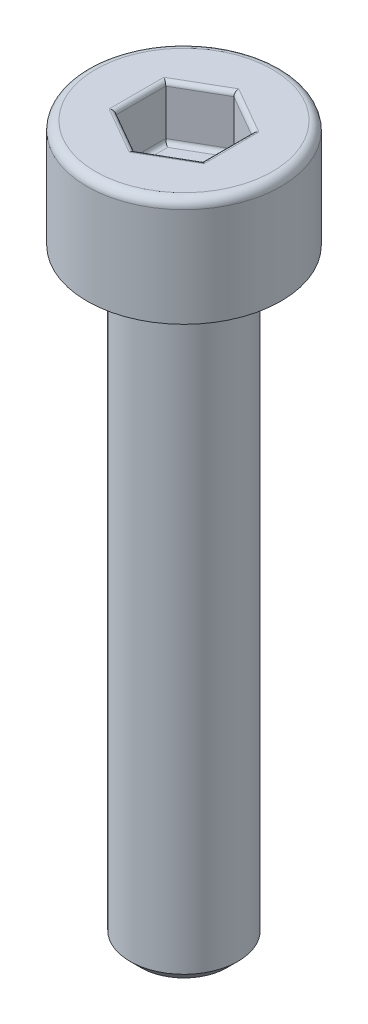
ISO-10303-21;
HEADER;
FILE_DESCRIPTION(('STEP AP214'),'2;1');
FILE_NAME('part.step','',(''),(''),'','','');
FILE_SCHEMA(('AUTOMOTIVE_DESIGN { 1 0 10303 214 1 1 1 1 }'));
ENDSEC;
DATA;
#1=APPLICATION_CONTEXT('core data for automotive mechanical design processes');
#2=APPLICATION_PROTOCOL_DEFINITION('international standard','automotive_design',2000,#1);
#3=PRODUCT_CONTEXT('',#1,'mechanical');
#4=PRODUCT('Part','Part','',(#3));
#5=PRODUCT_RELATED_PRODUCT_CATEGORY('part','',(#4));
#6=PRODUCT_DEFINITION_FORMATION('','',#4);
#7=PRODUCT_DEFINITION_CONTEXT('part definition',#1,'design');
#8=PRODUCT_DEFINITION('design','',#6,#7);
#9=PRODUCT_DEFINITION_SHAPE('','',#8);
#10=(LENGTH_UNIT() NAMED_UNIT(*) SI_UNIT(.MILLI.,.METRE.));
#11=(NAMED_UNIT(*) PLANE_ANGLE_UNIT() SI_UNIT($,.RADIAN.));
#12=(NAMED_UNIT(*) SI_UNIT($,.STERADIAN.) SOLID_ANGLE_UNIT());
#13=UNCERTAINTY_MEASURE_WITH_UNIT(LENGTH_MEASURE(1.E-05),#10,'distance_accuracy_value','');
#14=(GEOMETRIC_REPRESENTATION_CONTEXT(3) GLOBAL_UNCERTAINTY_ASSIGNED_CONTEXT((#13)) GLOBAL_UNIT_ASSIGNED_CONTEXT((#10,
#11,#12)) REPRESENTATION_CONTEXT('',''));
#15=CARTESIAN_POINT('',(0.,0.,0.));
#16=DIRECTION('',(0.,0.,1.));
#17=DIRECTION('',(1.,0.,0.));
#18=AXIS2_PLACEMENT_3D('',#15,#16,#17);
#19=CARTESIAN_POINT('',(0.,-16.5,0.));
#20=DIRECTION('',(0.,-1.,0.));
#21=DIRECTION('',(0.,0.,-1.));
#22=AXIS2_PLACEMENT_3D('',#19,#20,#21);
#23=PLANE('',#22);
#24=CARTESIAN_POINT('',(0.,-16.5,0.));
#25=DIRECTION('',(0.,-1.,0.));
#26=DIRECTION('',(0.,0.,-1.));
#27=AXIS2_PLACEMENT_3D('',#24,#25,#26);
#28=CIRCLE('',#27,0.999999999999997);
#29=CARTESIAN_POINT('',(0.,-16.5,-0.999999999999997));
#30=VERTEX_POINT('',#29);
#31=EDGE_CURVE('E261',#30,#30,#28,.T.);
#32=ORIENTED_EDGE('',*,*,#31,.T.);
#33=EDGE_LOOP('',(#32));
#34=FACE_BOUND('',#33,.T.);
#35=ADVANCED_FACE('F33',(#34),#23,.T.);
#36=CARTESIAN_POINT('',(0.,0.,0.));
#37=DIRECTION('',(0.,1.,0.));
#38=DIRECTION('',(0.,0.,1.));
#39=AXIS2_PLACEMENT_3D('',#36,#37,#38);
#40=CYLINDRICAL_SURFACE('',#39,1.25);
#41=CARTESIAN_POINT('',(0.,-2.75,0.));
#42=DIRECTION('',(0.,-1.,0.));
#43=DIRECTION('',(0.,0.,-1.));
#44=AXIS2_PLACEMENT_3D('',#41,#42,#43);
#45=CIRCLE('',#44,1.25);
#46=CARTESIAN_POINT('',(0.,-2.75,-1.25));
#47=VERTEX_POINT('',#46);
#48=EDGE_CURVE('E258',#47,#47,#45,.T.);
#49=ORIENTED_EDGE('',*,*,#48,.T.);
#50=EDGE_LOOP('',(#49));
#51=FACE_BOUND('',#50,.T.);
#52=CARTESIAN_POINT('',(0.,-16.25,0.));
#53=DIRECTION('',(0.,-1.,0.));
#54=DIRECTION('',(0.,0.,-1.));
#55=AXIS2_PLACEMENT_3D('',#52,#53,#54);
#56=CIRCLE('',#55,1.25);
#57=CARTESIAN_POINT('',(0.,-16.25,-1.25));
#58=VERTEX_POINT('',#57);
#59=EDGE_CURVE('E255',#58,#58,#56,.F.);
#60=ORIENTED_EDGE('',*,*,#59,.T.);
#61=EDGE_LOOP('',(#60));
#62=FACE_BOUND('',#61,.T.);
#63=ADVANCED_FACE('F287',(#51,#62),#40,.T.);
#64=CARTESIAN_POINT('',(-1.25,-2.5,0.));
#65=DIRECTION('',(0.,-1.,0.));
#66=DIRECTION('',(0.,0.,-1.));
#67=AXIS2_PLACEMENT_3D('',#64,#65,#66);
#68=PLANE('',#67);
#69=CARTESIAN_POINT('',(0.,-2.5,0.));
#70=DIRECTION('',(0.,-1.,0.));
#71=DIRECTION('',(0.,0.,-1.));
#72=AXIS2_PLACEMENT_3D('',#69,#70,#71);
#73=CIRCLE('',#72,1.49999999999999);
#74=CARTESIAN_POINT('',(0.,-2.5,-1.49999999999999));
#75=VERTEX_POINT('',#74);
#76=EDGE_CURVE('E252',#75,#75,#73,.F.);
#77=ORIENTED_EDGE('',*,*,#76,.T.);
#78=EDGE_LOOP('',(#77));
#79=FACE_BOUND('',#78,.T.);
#80=CARTESIAN_POINT('',(0.,-2.5,0.));
#81=DIRECTION('',(0.,1.,0.));
#82=DIRECTION('',(0.,0.,1.));
#83=AXIS2_PLACEMENT_3D('',#80,#81,#82);
#84=CIRCLE('',#83,2.25);
#85=CARTESIAN_POINT('',(0.,-2.5,2.25));
#86=VERTEX_POINT('',#85);
#87=EDGE_CURVE('E249',#86,#86,#84,.T.);
#88=ORIENTED_EDGE('',*,*,#87,.F.);
#89=EDGE_LOOP('',(#88));
#90=FACE_BOUND('',#89,.T.);
#91=ADVANCED_FACE('F293',(#79,#90),#68,.T.);
#92=CARTESIAN_POINT('',(0.,0.,0.));
#93=DIRECTION('',(0.,1.,0.));
#94=DIRECTION('',(0.,0.,1.));
#95=AXIS2_PLACEMENT_3D('',#92,#93,#94);
#96=CYLINDRICAL_SURFACE('',#95,2.25);
#97=CARTESIAN_POINT('',(0.,-0.2,0.));
#98=DIRECTION('',(0.,1.,0.));
#99=DIRECTION('',(0.,0.,1.));
#100=AXIS2_PLACEMENT_3D('',#97,#98,#99);
#101=CIRCLE('',#100,2.25);
#102=CARTESIAN_POINT('',(0.,-0.2,2.25));
#103=VERTEX_POINT('',#102);
#104=EDGE_CURVE('E159',#103,#103,#101,.F.);
#105=ORIENTED_EDGE('',*,*,#104,.T.);
#106=EDGE_LOOP('',(#105));
#107=FACE_BOUND('',#106,.T.);
#108=ORIENTED_EDGE('',*,*,#87,.T.);
#109=EDGE_LOOP('',(#108));
#110=FACE_BOUND('',#109,.T.);
#111=ADVANCED_FACE('F303',(#107,#110),#96,.T.);
#112=CARTESIAN_POINT('',(-2.25,0.,0.));
#113=DIRECTION('',(0.,1.,0.));
#114=DIRECTION('',(0.,0.,1.));
#115=AXIS2_PLACEMENT_3D('',#112,#113,#114);
#116=PLANE('',#115);
#117=DIRECTION('',(0.,0.,1.));
#118=VECTOR('',#117,1.);
#119=CARTESIAN_POINT('',(-1.1,0.,-0.577350269189627));
#120=LINE('',#119,#118);
#121=CARTESIAN_POINT('',(-1.1,0.,0.635085296108588));
#122=VERTEX_POINT('',#121);
#123=CARTESIAN_POINT('',(-1.1,0.,-0.635085296108589));
#124=VERTEX_POINT('',#123);
#125=EDGE_CURVE('E175',#122,#124,#120,.F.);
#126=ORIENTED_EDGE('',*,*,#125,.T.);
#127=DIRECTION('',(-0.866025403784439,0.,0.5));
#128=VECTOR('',#127,1.);
#129=CARTESIAN_POINT('',(-0.0500000000000009,0.,-1.2413030787577));
#130=LINE('',#129,#128);
#131=CARTESIAN_POINT('',(0.,0.,-1.27017059221718));
#132=VERTEX_POINT('',#131);
#133=EDGE_CURVE('E134',#124,#132,#130,.F.);
#134=ORIENTED_EDGE('',*,*,#133,.T.);
#135=DIRECTION('',(-0.866025403784439,0.,-0.5));
#136=VECTOR('',#135,1.);
#137=CARTESIAN_POINT('',(1.05,0.,-0.663952809568071));
#138=LINE('',#137,#136);
#139=CARTESIAN_POINT('',(1.1,0.,-0.63508529610859));
#140=VERTEX_POINT('',#139);
#141=EDGE_CURVE('E161',#132,#140,#138,.F.);
#142=ORIENTED_EDGE('',*,*,#141,.T.);
#143=DIRECTION('',(0.,0.,-1.));
#144=VECTOR('',#143,1.);
#145=CARTESIAN_POINT('',(1.1,0.,0.577350269189625));
#146=LINE('',#145,#144);
#147=CARTESIAN_POINT('',(1.1,0.,0.635085296108588));
#148=VERTEX_POINT('',#147);
#149=EDGE_CURVE('E169',#140,#148,#146,.F.);
#150=ORIENTED_EDGE('',*,*,#149,.T.);
#151=DIRECTION('',(0.866025403784439,0.,-0.5));
#152=VECTOR('',#151,1.);
#153=CARTESIAN_POINT('',(0.0499999999999991,0.,1.24130307875769));
#154=LINE('',#153,#152);
#155=CARTESIAN_POINT('',(0.,0.,1.27017059221718));
#156=VERTEX_POINT('',#155);
#157=EDGE_CURVE('E171',#148,#156,#154,.F.);
#158=ORIENTED_EDGE('',*,*,#157,.T.);
#159=DIRECTION('',(0.866025403784439,0.,0.5));
#160=VECTOR('',#159,1.);
#161=CARTESIAN_POINT('',(-1.05,0.,0.663952809568069));
#162=LINE('',#161,#160);
#163=EDGE_CURVE('E173',#156,#122,#162,.F.);
#164=ORIENTED_EDGE('',*,*,#163,.T.);
#165=EDGE_LOOP('',(#126,#134,#142,#150,#158,#164));
#166=FACE_BOUND('',#165,.T.);
#167=CARTESIAN_POINT('',(0.,0.,0.));
#168=DIRECTION('',(0.,1.,0.));
#169=DIRECTION('',(0.,0.,1.));
#170=AXIS2_PLACEMENT_3D('',#167,#168,#169);
#171=CIRCLE('',#170,2.05);
#172=CARTESIAN_POINT('',(0.,0.,2.05));
#173=VERTEX_POINT('',#172);
#174=EDGE_CURVE('E164',#173,#173,#171,.T.);
#175=ORIENTED_EDGE('',*,*,#174,.T.);
#176=EDGE_LOOP('',(#175));
#177=FACE_BOUND('',#176,.T.);
#178=ADVANCED_FACE('F266',(#166,#177),#116,.T.);
#179=CARTESIAN_POINT('',(0.,-2.5,0.));
#180=DIRECTION('',(0.,1.,0.));
#181=DIRECTION('',(0.,0.,1.));
#182=AXIS2_PLACEMENT_3D('',#179,#180,#181);
#183=CONICAL_SURFACE('',#182,1.49999999999999,0.78539816339745);
#184=ORIENTED_EDGE('',*,*,#48,.F.);
#185=EDGE_LOOP('',(#184));
#186=FACE_BOUND('',#185,.T.);
#187=ORIENTED_EDGE('',*,*,#76,.F.);
#188=EDGE_LOOP('',(#187));
#189=FACE_BOUND('',#188,.T.);
#190=ADVANCED_FACE('F281',(#186,#189),#183,.T.);
#191=CARTESIAN_POINT('',(0.,-16.25,0.));
#192=DIRECTION('',(0.,1.,0.));
#193=DIRECTION('',(0.,0.,1.));
#194=AXIS2_PLACEMENT_3D('',#191,#192,#193);
#195=CONICAL_SURFACE('',#194,1.25,0.785398163397447);
#196=ORIENTED_EDGE('',*,*,#31,.F.);
#197=EDGE_LOOP('',(#196));
#198=FACE_BOUND('',#197,.T.);
#199=ORIENTED_EDGE('',*,*,#59,.F.);
#200=EDGE_LOOP('',(#199));
#201=FACE_BOUND('',#200,.T.);
#202=ADVANCED_FACE('F271',(#198,#201),#195,.T.);
#203=CARTESIAN_POINT('',(0.,-0.2,0.));
#204=DIRECTION('',(0.,1.,0.));
#205=DIRECTION('',(0.,0.,1.));
#206=AXIS2_PLACEMENT_3D('',#203,#204,#205);
#207=TOROIDAL_SURFACE('',#206,2.05,0.2);
#208=ORIENTED_EDGE('',*,*,#104,.F.);
#209=EDGE_LOOP('',(#208));
#210=FACE_BOUND('',#209,.T.);
#211=ORIENTED_EDGE('',*,*,#174,.F.);
#212=EDGE_LOOP('',(#211));
#213=FACE_BOUND('',#212,.T.);
#214=ADVANCED_FACE('F268',(#210,#213),#207,.T.);
#215=CARTESIAN_POINT('',(0.999999999999998,-1.25,-0.577350269189627));
#216=DIRECTION('',(0.5,0.,-0.866025403784439));
#217=DIRECTION('',(-0.866025403784439,0.,-0.5));
#218=AXIS2_PLACEMENT_3D('',#215,#216,#217);
#219=PLANE('',#218);
#220=DIRECTION('',(0.,1.,0.));
#221=VECTOR('',#220,1.);
#222=CARTESIAN_POINT('',(0.999999999999998,-1.25,-0.577350269189627));
#223=LINE('',#222,#221);
#224=CARTESIAN_POINT('',(0.999999999999998,-1.15,-0.577350269189627));
#225=VERTEX_POINT('',#224);
#226=CARTESIAN_POINT('',(0.999999999999998,-0.1,-0.577350269189627));
#227=VERTEX_POINT('',#226);
#228=EDGE_CURVE('E243',#225,#227,#223,.T.);
#229=ORIENTED_EDGE('',*,*,#228,.T.);
#230=DIRECTION('',(-0.866025403784439,0.,-0.5));
#231=VECTOR('',#230,1.);
#232=CARTESIAN_POINT('',(0.,-0.1,-1.15470053837925));
#233=LINE('',#232,#231);
#234=CARTESIAN_POINT('',(0.,-0.1,-1.15470053837925));
#235=VERTEX_POINT('',#234);
#236=EDGE_CURVE('E195',#227,#235,#233,.T.);
#237=ORIENTED_EDGE('',*,*,#236,.T.);
#238=DIRECTION('',(0.,1.,0.));
#239=VECTOR('',#238,1.);
#240=CARTESIAN_POINT('',(0.,-1.25,-1.15470053837925));
#241=LINE('',#240,#239);
#242=CARTESIAN_POINT('',(0.,-1.15,-1.15470053837925));
#243=VERTEX_POINT('',#242);
#244=EDGE_CURVE('E145',#243,#235,#241,.T.);
#245=ORIENTED_EDGE('',*,*,#244,.F.);
#246=DIRECTION('',(-0.866025403784439,0.,-0.5));
#247=VECTOR('',#246,1.);
#248=CARTESIAN_POINT('',(0.999999999999998,-1.15,-0.577350269189627));
#249=LINE('',#248,#247);
#250=EDGE_CURVE('E193',#243,#225,#249,.F.);
#251=ORIENTED_EDGE('',*,*,#250,.T.);
#252=EDGE_LOOP('',(#229,#237,#245,#251));
#253=FACE_BOUND('',#252,.T.);
#254=ADVANCED_FACE('F270',(#253),#219,.F.);
#255=CARTESIAN_POINT('',(0.999999999999999,-1.25,0.577350269189625));
#256=DIRECTION('',(1.,0.,0.));
#257=DIRECTION('',(0.,0.,-1.));
#258=AXIS2_PLACEMENT_3D('',#255,#256,#257);
#259=PLANE('',#258);
#260=DIRECTION('',(0.,1.,0.));
#261=VECTOR('',#260,1.);
#262=CARTESIAN_POINT('',(0.999999999999999,-1.25,0.577350269189625));
#263=LINE('',#262,#261);
#264=CARTESIAN_POINT('',(0.999999999999999,-1.15,0.577350269189625));
#265=VERTEX_POINT('',#264);
#266=CARTESIAN_POINT('',(0.999999999999999,-0.1,0.577350269189625));
#267=VERTEX_POINT('',#266);
#268=EDGE_CURVE('E240',#265,#267,#263,.T.);
#269=ORIENTED_EDGE('',*,*,#268,.T.);
#270=DIRECTION('',(0.,0.,-1.));
#271=VECTOR('',#270,1.);
#272=CARTESIAN_POINT('',(0.999999999999998,-0.1,-0.577350269189627));
#273=LINE('',#272,#271);
#274=EDGE_CURVE('E191',#267,#227,#273,.T.);
#275=ORIENTED_EDGE('',*,*,#274,.T.);
#276=ORIENTED_EDGE('',*,*,#228,.F.);
#277=DIRECTION('',(0.,0.,-1.));
#278=VECTOR('',#277,1.);
#279=CARTESIAN_POINT('',(0.999999999999999,-1.15,0.577350269189625));
#280=LINE('',#279,#278);
#281=EDGE_CURVE('E188',#225,#265,#280,.F.);
#282=ORIENTED_EDGE('',*,*,#281,.T.);
#283=EDGE_LOOP('',(#269,#275,#276,#282));
#284=FACE_BOUND('',#283,.T.);
#285=ADVANCED_FACE('F278',(#284),#259,.F.);
#286=CARTESIAN_POINT('',(0.,-1.25,1.15470053837925));
#287=DIRECTION('',(0.5,0.,0.866025403784439));
#288=DIRECTION('',(0.866025403784439,0.,-0.5));
#289=AXIS2_PLACEMENT_3D('',#286,#287,#288);
#290=PLANE('',#289);
#291=DIRECTION('',(0.,1.,0.));
#292=VECTOR('',#291,1.);
#293=CARTESIAN_POINT('',(0.,-1.25,1.15470053837925));
#294=LINE('',#293,#292);
#295=CARTESIAN_POINT('',(0.,-1.15,1.15470053837925));
#296=VERTEX_POINT('',#295);
#297=CARTESIAN_POINT('',(0.,-0.1,1.15470053837925));
#298=VERTEX_POINT('',#297);
#299=EDGE_CURVE('E237',#296,#298,#294,.T.);
#300=ORIENTED_EDGE('',*,*,#299,.T.);
#301=DIRECTION('',(0.866025403784439,0.,-0.5));
#302=VECTOR('',#301,1.);
#303=CARTESIAN_POINT('',(0.999999999999999,-0.1,0.577350269189625));
#304=LINE('',#303,#302);
#305=EDGE_CURVE('E186',#298,#267,#304,.T.);
#306=ORIENTED_EDGE('',*,*,#305,.T.);
#307=ORIENTED_EDGE('',*,*,#268,.F.);
#308=DIRECTION('',(0.866025403784439,0.,-0.5));
#309=VECTOR('',#308,1.);
#310=CARTESIAN_POINT('',(0.,-1.15,1.15470053837925));
#311=LINE('',#310,#309);
#312=EDGE_CURVE('E184',#265,#296,#311,.F.);
#313=ORIENTED_EDGE('',*,*,#312,.T.);
#314=EDGE_LOOP('',(#300,#306,#307,#313));
#315=FACE_BOUND('',#314,.T.);
#316=ADVANCED_FACE('F327',(#315),#290,.F.);
#317=CARTESIAN_POINT('',(-1.,-1.25,0.577350269189625));
#318=DIRECTION('',(-0.5,0.,0.866025403784438));
#319=DIRECTION('',(0.866025403784439,0.,0.5));
#320=AXIS2_PLACEMENT_3D('',#317,#318,#319);
#321=PLANE('',#320);
#322=DIRECTION('',(0.,1.,0.));
#323=VECTOR('',#322,1.);
#324=CARTESIAN_POINT('',(-1.,-1.25,0.577350269189625));
#325=LINE('',#324,#323);
#326=CARTESIAN_POINT('',(-1.,-1.15,0.577350269189625));
#327=VERTEX_POINT('',#326);
#328=CARTESIAN_POINT('',(-1.,-0.1,0.577350269189625));
#329=VERTEX_POINT('',#328);
#330=EDGE_CURVE('E128',#327,#329,#325,.T.);
#331=ORIENTED_EDGE('',*,*,#330,.T.);
#332=DIRECTION('',(0.866025403784439,0.,0.5));
#333=VECTOR('',#332,1.);
#334=CARTESIAN_POINT('',(0.,-0.1,1.15470053837925));
#335=LINE('',#334,#333);
#336=EDGE_CURVE('E182',#329,#298,#335,.T.);
#337=ORIENTED_EDGE('',*,*,#336,.T.);
#338=ORIENTED_EDGE('',*,*,#299,.F.);
#339=DIRECTION('',(0.866025403784439,0.,0.5));
#340=VECTOR('',#339,1.);
#341=CARTESIAN_POINT('',(-1.,-1.15,0.577350269189625));
#342=LINE('',#341,#340);
#343=EDGE_CURVE('E180',#296,#327,#342,.F.);
#344=ORIENTED_EDGE('',*,*,#343,.T.);
#345=EDGE_LOOP('',(#331,#337,#338,#344));
#346=FACE_BOUND('',#345,.T.);
#347=ADVANCED_FACE('F234',(#346),#321,.F.);
#348=CARTESIAN_POINT('',(-1.,-1.25,-0.577350269189627));
#349=DIRECTION('',(-1.,0.,0.));
#350=DIRECTION('',(0.,0.,1.));
#351=AXIS2_PLACEMENT_3D('',#348,#349,#350);
#352=PLANE('',#351);
#353=DIRECTION('',(0.,1.,0.));
#354=VECTOR('',#353,1.);
#355=CARTESIAN_POINT('',(-1.,-1.25,-0.577350269189627));
#356=LINE('',#355,#354);
#357=CARTESIAN_POINT('',(-1.,-1.15,-0.577350269189627));
#358=VERTEX_POINT('',#357);
#359=CARTESIAN_POINT('',(-1.,-0.1,-0.577350269189627));
#360=VERTEX_POINT('',#359);
#361=EDGE_CURVE('E126',#358,#360,#356,.T.);
#362=ORIENTED_EDGE('',*,*,#361,.T.);
#363=DIRECTION('',(0.,0.,1.));
#364=VECTOR('',#363,1.);
#365=CARTESIAN_POINT('',(-1.,-0.1,0.577350269189625));
#366=LINE('',#365,#364);
#367=EDGE_CURVE('E133',#360,#329,#366,.T.);
#368=ORIENTED_EDGE('',*,*,#367,.T.);
#369=ORIENTED_EDGE('',*,*,#330,.F.);
#370=DIRECTION('',(0.,0.,1.));
#371=VECTOR('',#370,1.);
#372=CARTESIAN_POINT('',(-1.,-1.15,-0.577350269189627));
#373=LINE('',#372,#371);
#374=EDGE_CURVE('E123',#327,#358,#373,.F.);
#375=ORIENTED_EDGE('',*,*,#374,.T.);
#376=EDGE_LOOP('',(#362,#368,#369,#375));
#377=FACE_BOUND('',#376,.T.);
#378=ADVANCED_FACE('F125',(#377),#352,.F.);
#379=CARTESIAN_POINT('',(0.,-1.25,-1.15470053837925));
#380=DIRECTION('',(-0.5,0.,-0.866025403784438));
#381=DIRECTION('',(-0.866025403784439,0.,0.5));
#382=AXIS2_PLACEMENT_3D('',#379,#380,#381);
#383=PLANE('',#382);
#384=ORIENTED_EDGE('',*,*,#244,.T.);
#385=DIRECTION('',(-0.866025403784439,0.,0.5));
#386=VECTOR('',#385,1.);
#387=CARTESIAN_POINT('',(-1.,-0.1,-0.577350269189626));
#388=LINE('',#387,#386);
#389=EDGE_CURVE('E144',#235,#360,#388,.T.);
#390=ORIENTED_EDGE('',*,*,#389,.T.);
#391=ORIENTED_EDGE('',*,*,#361,.F.);
#392=DIRECTION('',(-0.866025403784439,0.,0.5));
#393=VECTOR('',#392,1.);
#394=CARTESIAN_POINT('',(0.,-1.15,-1.15470053837925));
#395=LINE('',#394,#393);
#396=EDGE_CURVE('E141',#358,#243,#395,.F.);
#397=ORIENTED_EDGE('',*,*,#396,.T.);
#398=EDGE_LOOP('',(#384,#390,#391,#397));
#399=FACE_BOUND('',#398,.T.);
#400=ADVANCED_FACE('F139',(#399),#383,.F.);
#401=CARTESIAN_POINT('',(0.,-1.25,-1.15470053837925));
#402=DIRECTION('',(0.,1.,0.));
#403=DIRECTION('',(0.,0.,1.));
#404=AXIS2_PLACEMENT_3D('',#401,#402,#403);
#405=PLANE('',#404);
#406=DIRECTION('',(0.866025403784439,0.,-0.5));
#407=VECTOR('',#406,1.);
#408=CARTESIAN_POINT('',(0.949999999999999,-1.25,0.490747728811181));
#409=LINE('',#408,#407);
#410=CARTESIAN_POINT('',(0.,-1.25,1.03923048454133));
#411=VERTEX_POINT('',#410);
#412=CARTESIAN_POINT('',(0.899999999999999,-1.25,0.519615242270663));
#413=VERTEX_POINT('',#412);
#414=EDGE_CURVE('E42',#411,#413,#409,.T.);
#415=ORIENTED_EDGE('',*,*,#414,.T.);
#416=DIRECTION('',(0.,0.,-1.));
#417=VECTOR('',#416,1.);
#418=CARTESIAN_POINT('',(0.899999999999998,-1.25,-1.15470053837925));
#419=LINE('',#418,#417);
#420=CARTESIAN_POINT('',(0.899999999999998,-1.25,-0.519615242270664));
#421=VERTEX_POINT('',#420);
#422=EDGE_CURVE('E11',#413,#421,#419,.T.);
#423=ORIENTED_EDGE('',*,*,#422,.T.);
#424=DIRECTION('',(-0.866025403784439,0.,-0.5));
#425=VECTOR('',#424,1.);
#426=CARTESIAN_POINT('',(-0.0500000000000008,-1.25,-1.06809799800081));
#427=LINE('',#426,#425);
#428=CARTESIAN_POINT('',(0.,-1.25,-1.03923048454133));
#429=VERTEX_POINT('',#428);
#430=EDGE_CURVE('E197',#421,#429,#427,.T.);
#431=ORIENTED_EDGE('',*,*,#430,.T.);
#432=DIRECTION('',(-0.866025403784439,0.,0.5));
#433=VECTOR('',#432,1.);
#434=CARTESIAN_POINT('',(0.0499999999999993,-1.25,-1.06809799800081));
#435=LINE('',#434,#433);
#436=CARTESIAN_POINT('',(-0.9,-1.25,-0.519615242270664));
#437=VERTEX_POINT('',#436);
#438=EDGE_CURVE('E199',#429,#437,#435,.T.);
#439=ORIENTED_EDGE('',*,*,#438,.T.);
#440=DIRECTION('',(0.,0.,1.));
#441=VECTOR('',#440,1.);
#442=CARTESIAN_POINT('',(-0.9,-1.25,-1.15470053837925));
#443=LINE('',#442,#441);
#444=CARTESIAN_POINT('',(-0.9,-1.25,0.519615242270662));
#445=VERTEX_POINT('',#444);
#446=EDGE_CURVE('E150',#437,#445,#443,.T.);
#447=ORIENTED_EDGE('',*,*,#446,.T.);
#448=DIRECTION('',(0.866025403784439,0.,0.5));
#449=VECTOR('',#448,1.);
#450=CARTESIAN_POINT('',(-0.950000000000001,-1.25,0.490747728811181));
#451=LINE('',#450,#449);
#452=EDGE_CURVE('E53',#445,#411,#451,.T.);
#453=ORIENTED_EDGE('',*,*,#452,.T.);
#454=EDGE_LOOP('',(#415,#423,#431,#439,#447,#453));
#455=FACE_BOUND('',#454,.T.);
#456=ADVANCED_FACE('F322',(#455),#405,.T.);
#457=CARTESIAN_POINT('',(0.0499999999999991,-0.1,1.24130307875769));
#458=DIRECTION('',(-0.866025403784439,0.,0.5));
#459=DIRECTION('',(0.5,0.,0.866025403784439));
#460=AXIS2_PLACEMENT_3D('',#457,#458,#459);
#461=CYLINDRICAL_SURFACE('',#460,0.1);
#462=CARTESIAN_POINT('',(0.,-0.1,1.27017059221718));
#463=DIRECTION('',(-1.,0.,0.));
#464=DIRECTION('',(0.,0.,-1.));
#465=AXIS2_PLACEMENT_3D('',#462,#463,#464);
#466=ELLIPSE('',#465,0.115470053837925,0.1);
#467=EDGE_CURVE('E214',#156,#298,#466,.T.);
#468=ORIENTED_EDGE('',*,*,#467,.F.);
#469=ORIENTED_EDGE('',*,*,#157,.F.);
#470=CARTESIAN_POINT('',(1.1,-0.1,0.635085296108588));
#471=DIRECTION('',(-0.5,0.,0.866025403784439));
#472=DIRECTION('',(-0.866025403784439,0.,-0.5));
#473=AXIS2_PLACEMENT_3D('',#470,#471,#472);
#474=ELLIPSE('',#473,0.115470053837925,0.1);
#475=EDGE_CURVE('E217',#267,#148,#474,.F.);
#476=ORIENTED_EDGE('',*,*,#475,.F.);
#477=ORIENTED_EDGE('',*,*,#305,.F.);
#478=EDGE_LOOP('',(#468,#469,#476,#477));
#479=FACE_BOUND('',#478,.T.);
#480=ADVANCED_FACE('F334',(#479),#461,.T.);
#481=CARTESIAN_POINT('',(1.1,-0.1,0.577350269189625));
#482=DIRECTION('',(0.,0.,1.));
#483=DIRECTION('',(1.,0.,0.));
#484=AXIS2_PLACEMENT_3D('',#481,#482,#483);
#485=CYLINDRICAL_SURFACE('',#484,0.1);
#486=ORIENTED_EDGE('',*,*,#475,.T.);
#487=ORIENTED_EDGE('',*,*,#149,.F.);
#488=CARTESIAN_POINT('',(1.1,-0.1,-0.63508529610859));
#489=DIRECTION('',(0.5,0.,0.866025403784439));
#490=DIRECTION('',(-0.866025403784439,0.,0.5));
#491=AXIS2_PLACEMENT_3D('',#488,#489,#490);
#492=ELLIPSE('',#491,0.115470053837925,0.1);
#493=EDGE_CURVE('E211',#227,#140,#492,.F.);
#494=ORIENTED_EDGE('',*,*,#493,.F.);
#495=ORIENTED_EDGE('',*,*,#274,.F.);
#496=EDGE_LOOP('',(#486,#487,#494,#495));
#497=FACE_BOUND('',#496,.T.);
#498=ADVANCED_FACE('F338',(#497),#485,.T.);
#499=CARTESIAN_POINT('',(-1.05,-0.1,0.663952809568069));
#500=DIRECTION('',(-0.866025403784439,0.,-0.5));
#501=DIRECTION('',(-0.5,0.,0.866025403784438));
#502=AXIS2_PLACEMENT_3D('',#499,#500,#501);
#503=CYLINDRICAL_SURFACE('',#502,0.1);
#504=ORIENTED_EDGE('',*,*,#467,.T.);
#505=ORIENTED_EDGE('',*,*,#336,.F.);
#506=CARTESIAN_POINT('',(-1.1,-0.1,0.635085296108587));
#507=DIRECTION('',(-0.5,0.,-0.866025403784439));
#508=DIRECTION('',(0.866025403784439,0.,-0.5));
#509=AXIS2_PLACEMENT_3D('',#506,#507,#508);
#510=ELLIPSE('',#509,0.115470053837925,0.1);
#511=EDGE_CURVE('E208',#122,#329,#510,.T.);
#512=ORIENTED_EDGE('',*,*,#511,.F.);
#513=ORIENTED_EDGE('',*,*,#163,.F.);
#514=EDGE_LOOP('',(#504,#505,#512,#513));
#515=FACE_BOUND('',#514,.T.);
#516=ADVANCED_FACE('F344',(#515),#503,.T.);
#517=CARTESIAN_POINT('',(1.05,-0.1,-0.663952809568071));
#518=DIRECTION('',(0.866025403784439,0.,0.5));
#519=DIRECTION('',(0.5,0.,-0.866025403784439));
#520=AXIS2_PLACEMENT_3D('',#517,#518,#519);
#521=CYLINDRICAL_SURFACE('',#520,0.1);
#522=ORIENTED_EDGE('',*,*,#493,.T.);
#523=ORIENTED_EDGE('',*,*,#141,.F.);
#524=CARTESIAN_POINT('',(0.,-0.1,-1.27017059221718));
#525=DIRECTION('',(1.,0.,0.));
#526=DIRECTION('',(0.,0.,-1.));
#527=AXIS2_PLACEMENT_3D('',#524,#525,#526);
#528=ELLIPSE('',#527,0.115470053837925,0.1);
#529=EDGE_CURVE('E206',#235,#132,#528,.F.);
#530=ORIENTED_EDGE('',*,*,#529,.F.);
#531=ORIENTED_EDGE('',*,*,#236,.F.);
#532=EDGE_LOOP('',(#522,#523,#530,#531));
#533=FACE_BOUND('',#532,.T.);
#534=ADVANCED_FACE('F374',(#533),#521,.T.);
#535=CARTESIAN_POINT('',(-1.1,-0.1,-0.577350269189627));
#536=DIRECTION('',(0.,0.,-1.));
#537=DIRECTION('',(-1.,0.,0.));
#538=AXIS2_PLACEMENT_3D('',#535,#536,#537);
#539=CYLINDRICAL_SURFACE('',#538,0.1);
#540=ORIENTED_EDGE('',*,*,#511,.T.);
#541=ORIENTED_EDGE('',*,*,#367,.F.);
#542=CARTESIAN_POINT('',(-1.1,-0.1,-0.635085296108589));
#543=DIRECTION('',(0.5,0.,-0.866025403784439));
#544=DIRECTION('',(0.866025403784439,0.,0.5));
#545=AXIS2_PLACEMENT_3D('',#542,#543,#544);
#546=ELLIPSE('',#545,0.115470053837925,0.1);
#547=EDGE_CURVE('E204',#124,#360,#546,.T.);
#548=ORIENTED_EDGE('',*,*,#547,.F.);
#549=ORIENTED_EDGE('',*,*,#125,.F.);
#550=EDGE_LOOP('',(#540,#541,#548,#549));
#551=FACE_BOUND('',#550,.T.);
#552=ADVANCED_FACE('F369',(#551),#539,.T.);
#553=CARTESIAN_POINT('',(-0.0500000000000009,-0.1,-1.2413030787577));
#554=DIRECTION('',(0.866025403784439,0.,-0.5));
#555=DIRECTION('',(-0.5,0.,-0.866025403784438));
#556=AXIS2_PLACEMENT_3D('',#553,#554,#555);
#557=CYLINDRICAL_SURFACE('',#556,0.1);
#558=ORIENTED_EDGE('',*,*,#529,.T.);
#559=ORIENTED_EDGE('',*,*,#133,.F.);
#560=ORIENTED_EDGE('',*,*,#547,.T.);
#561=ORIENTED_EDGE('',*,*,#389,.F.);
#562=EDGE_LOOP('',(#558,#559,#560,#561));
#563=FACE_BOUND('',#562,.T.);
#564=ADVANCED_FACE('F365',(#563),#557,.T.);
#565=CARTESIAN_POINT('',(-0.9,-1.15,-1.15470053837925));
#566=DIRECTION('',(0.,0.,1.));
#567=DIRECTION('',(1.,0.,0.));
#568=AXIS2_PLACEMENT_3D('',#565,#566,#567);
#569=CYLINDRICAL_SURFACE('',#568,0.1);
#570=CARTESIAN_POINT('',(-0.900000000000001,-1.15,-0.519615242270664));
#571=DIRECTION('',(-0.5,0.,0.866025403784439));
#572=DIRECTION('',(0.866025403784439,0.,0.5));
#573=AXIS2_PLACEMENT_3D('',#570,#571,#572);
#574=ELLIPSE('',#573,0.115470053837925,0.1);
#575=EDGE_CURVE('E149',#358,#437,#574,.T.);
#576=ORIENTED_EDGE('',*,*,#575,.F.);
#577=ORIENTED_EDGE('',*,*,#374,.F.);
#578=CARTESIAN_POINT('',(-0.9,-1.15,0.519615242270662));
#579=DIRECTION('',(0.5,0.,0.866025403784439));
#580=DIRECTION('',(0.866025403784439,0.,-0.5));
#581=AXIS2_PLACEMENT_3D('',#578,#579,#580);
#582=ELLIPSE('',#581,0.115470053837925,0.1);
#583=EDGE_CURVE('E37',#445,#327,#582,.F.);
#584=ORIENTED_EDGE('',*,*,#583,.F.);
#585=ORIENTED_EDGE('',*,*,#446,.F.);
#586=EDGE_LOOP('',(#576,#577,#584,#585));
#587=FACE_BOUND('',#586,.T.);
#588=ADVANCED_FACE('F35',(#587),#569,.F.);
#589=CARTESIAN_POINT('',(-0.950000000000001,-1.15,0.490747728811181));
#590=DIRECTION('',(0.866025403784439,0.,0.5));
#591=DIRECTION('',(0.5,0.,-0.866025403784438));
#592=AXIS2_PLACEMENT_3D('',#589,#590,#591);
#593=CYLINDRICAL_SURFACE('',#592,0.1);
#594=ORIENTED_EDGE('',*,*,#583,.T.);
#595=ORIENTED_EDGE('',*,*,#343,.F.);
#596=CARTESIAN_POINT('',(0.,-1.15,1.03923048454133));
#597=DIRECTION('',(1.,0.,0.));
#598=DIRECTION('',(0.,0.,-1.));
#599=AXIS2_PLACEMENT_3D('',#596,#597,#598);
#600=ELLIPSE('',#599,0.115470053837925,0.1);
#601=EDGE_CURVE('E153',#411,#296,#600,.F.);
#602=ORIENTED_EDGE('',*,*,#601,.F.);
#603=ORIENTED_EDGE('',*,*,#452,.F.);
#604=EDGE_LOOP('',(#594,#595,#602,#603));
#605=FACE_BOUND('',#604,.T.);
#606=ADVANCED_FACE('F231',(#605),#593,.F.);
#607=CARTESIAN_POINT('',(0.0499999999999993,-1.15,-1.06809799800081));
#608=DIRECTION('',(-0.866025403784439,0.,0.5));
#609=DIRECTION('',(0.5,0.,0.866025403784438));
#610=AXIS2_PLACEMENT_3D('',#607,#608,#609);
#611=CYLINDRICAL_SURFACE('',#610,0.1);
#612=ORIENTED_EDGE('',*,*,#575,.T.);
#613=ORIENTED_EDGE('',*,*,#438,.F.);
#614=CARTESIAN_POINT('',(0.,-1.15,-1.03923048454133));
#615=DIRECTION('',(-1.,0.,0.));
#616=DIRECTION('',(0.,0.,1.));
#617=AXIS2_PLACEMENT_3D('',#614,#615,#616);
#618=ELLIPSE('',#617,0.115470053837925,0.1);
#619=EDGE_CURVE('E157',#243,#429,#618,.T.);
#620=ORIENTED_EDGE('',*,*,#619,.F.);
#621=ORIENTED_EDGE('',*,*,#396,.F.);
#622=EDGE_LOOP('',(#612,#613,#620,#621));
#623=FACE_BOUND('',#622,.T.);
#624=ADVANCED_FACE('F155',(#623),#611,.F.);
#625=CARTESIAN_POINT('',(0.949999999999999,-1.15,0.490747728811181));
#626=DIRECTION('',(0.866025403784439,0.,-0.5));
#627=DIRECTION('',(-0.5,0.,-0.866025403784439));
#628=AXIS2_PLACEMENT_3D('',#625,#626,#627);
#629=CYLINDRICAL_SURFACE('',#628,0.1);
#630=ORIENTED_EDGE('',*,*,#601,.T.);
#631=ORIENTED_EDGE('',*,*,#312,.F.);
#632=CARTESIAN_POINT('',(0.899999999999999,-1.15,0.519615242270662));
#633=DIRECTION('',(0.5,0.,-0.866025403784439));
#634=DIRECTION('',(-0.866025403784439,0.,-0.5));
#635=AXIS2_PLACEMENT_3D('',#632,#633,#634);
#636=ELLIPSE('',#635,0.115470053837925,0.1);
#637=EDGE_CURVE('E222',#413,#265,#636,.F.);
#638=ORIENTED_EDGE('',*,*,#637,.F.);
#639=ORIENTED_EDGE('',*,*,#414,.F.);
#640=EDGE_LOOP('',(#630,#631,#638,#639));
#641=FACE_BOUND('',#640,.T.);
#642=ADVANCED_FACE('F228',(#641),#629,.F.);
#643=CARTESIAN_POINT('',(-0.0500000000000008,-1.15,-1.06809799800081));
#644=DIRECTION('',(-0.866025403784439,0.,-0.5));
#645=DIRECTION('',(-0.5,0.,0.866025403784439));
#646=AXIS2_PLACEMENT_3D('',#643,#644,#645);
#647=CYLINDRICAL_SURFACE('',#646,0.1);
#648=ORIENTED_EDGE('',*,*,#619,.T.);
#649=ORIENTED_EDGE('',*,*,#430,.F.);
#650=CARTESIAN_POINT('',(0.899999999999998,-1.15,-0.519615242270664));
#651=DIRECTION('',(-0.5,0.,-0.866025403784439));
#652=DIRECTION('',(0.866025403784439,0.,-0.5));
#653=AXIS2_PLACEMENT_3D('',#650,#651,#652);
#654=ELLIPSE('',#653,0.115470053837925,0.1);
#655=EDGE_CURVE('E220',#225,#421,#654,.T.);
#656=ORIENTED_EDGE('',*,*,#655,.F.);
#657=ORIENTED_EDGE('',*,*,#250,.F.);
#658=EDGE_LOOP('',(#648,#649,#656,#657));
#659=FACE_BOUND('',#658,.T.);
#660=ADVANCED_FACE('F353',(#659),#647,.F.);
#661=CARTESIAN_POINT('',(0.899999999999998,-1.15,-1.15470053837925));
#662=DIRECTION('',(0.,0.,-1.));
#663=DIRECTION('',(-1.,0.,0.));
#664=AXIS2_PLACEMENT_3D('',#661,#662,#663);
#665=CYLINDRICAL_SURFACE('',#664,0.1);
#666=ORIENTED_EDGE('',*,*,#637,.T.);
#667=ORIENTED_EDGE('',*,*,#281,.F.);
#668=ORIENTED_EDGE('',*,*,#655,.T.);
#669=ORIENTED_EDGE('',*,*,#422,.F.);
#670=EDGE_LOOP('',(#666,#667,#668,#669));
#671=FACE_BOUND('',#670,.T.);
#672=ADVANCED_FACE('F350',(#671),#665,.F.);
#673=CLOSED_SHELL('',(#35,#63,#91,#111,#178,#190,#202,#214,#254,#285,#316,#347,#378,#400,#456,
#480,#498,#516,#534,#552,#564,#588,#606,#624,#642,#660,#672));
#674=MANIFOLD_SOLID_BREP('B2',#673);
#675=ADVANCED_BREP_SHAPE_REPRESENTATION('',(#18,#674),#14);
#676=SHAPE_DEFINITION_REPRESENTATION(#9,#675);
ENDSEC;
END-ISO-10303-21;
